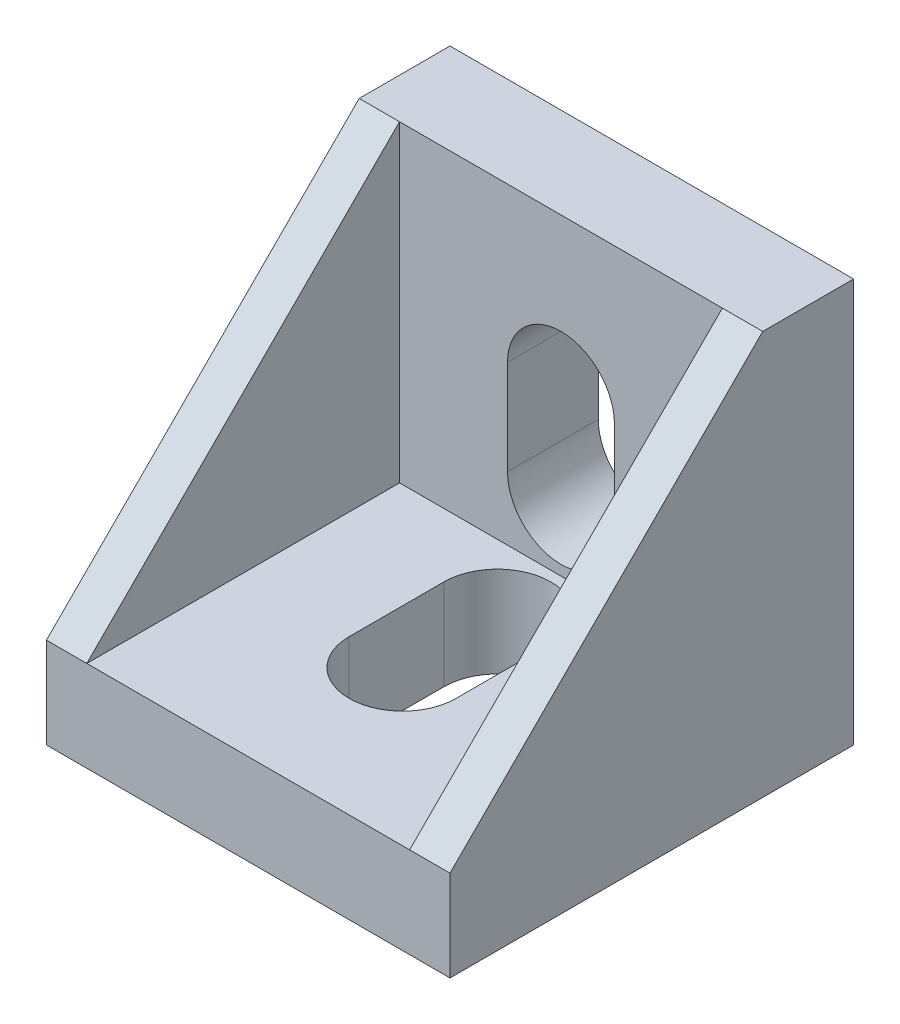
ISO-10303-21;
HEADER;
FILE_DESCRIPTION(('STEP AP214'),'2;1');
FILE_NAME('part.step','',(''),(''),'','','');
FILE_SCHEMA(('AUTOMOTIVE_DESIGN { 1 0 10303 214 1 1 1 1 }'));
ENDSEC;
DATA;
#1=APPLICATION_CONTEXT('core data for automotive mechanical design processes');
#2=APPLICATION_PROTOCOL_DEFINITION('international standard','automotive_design',2000,#1);
#3=PRODUCT_CONTEXT('',#1,'mechanical');
#4=PRODUCT('Part','Part','',(#3));
#5=PRODUCT_RELATED_PRODUCT_CATEGORY('part','',(#4));
#6=PRODUCT_DEFINITION_FORMATION('','',#4);
#7=PRODUCT_DEFINITION_CONTEXT('part definition',#1,'design');
#8=PRODUCT_DEFINITION('design','',#6,#7);
#9=PRODUCT_DEFINITION_SHAPE('','',#8);
#10=(LENGTH_UNIT() NAMED_UNIT(*) SI_UNIT(.MILLI.,.METRE.));
#11=(NAMED_UNIT(*) PLANE_ANGLE_UNIT() SI_UNIT($,.RADIAN.));
#12=(NAMED_UNIT(*) SI_UNIT($,.STERADIAN.) SOLID_ANGLE_UNIT());
#13=UNCERTAINTY_MEASURE_WITH_UNIT(LENGTH_MEASURE(1.E-05),#10,'distance_accuracy_value','');
#14=(GEOMETRIC_REPRESENTATION_CONTEXT(3) GLOBAL_UNCERTAINTY_ASSIGNED_CONTEXT((#13)) GLOBAL_UNIT_ASSIGNED_CONTEXT((#10,
#11,#12)) REPRESENTATION_CONTEXT('',''));
#15=CARTESIAN_POINT('',(0.,0.,0.));
#16=DIRECTION('',(0.,0.,1.));
#17=DIRECTION('',(1.,0.,0.));
#18=AXIS2_PLACEMENT_3D('',#15,#16,#17);
#19=CARTESIAN_POINT('',(0.,0.,4.5));
#20=DIRECTION('',(0.,0.,1.));
#21=DIRECTION('',(1.,0.,0.));
#22=AXIS2_PLACEMENT_3D('',#19,#20,#21);
#23=PLANE('',#22);
#24=DIRECTION('',(0.,-1.,0.));
#25=VECTOR('',#24,1.);
#26=CARTESIAN_POINT('',(7.35,0.,4.5));
#27=LINE('',#26,#25);
#28=CARTESIAN_POINT('',(7.35,5.17300884955752,4.5));
#29=VERTEX_POINT('',#28);
#30=CARTESIAN_POINT('',(7.35,0.473008849557522,4.5));
#31=VERTEX_POINT('',#30);
#32=EDGE_CURVE('E255',#29,#31,#27,.T.);
#33=ORIENTED_EDGE('',*,*,#32,.F.);
#34=CARTESIAN_POINT('',(10.,5.17300884955752,4.5));
#35=DIRECTION('',(0.,0.,1.));
#36=DIRECTION('',(1.,0.,0.));
#37=AXIS2_PLACEMENT_3D('',#34,#35,#36);
#38=CIRCLE('',#37,2.65);
#39=CARTESIAN_POINT('',(12.65,5.17300884955752,4.5));
#40=VERTEX_POINT('',#39);
#41=EDGE_CURVE('E259',#29,#40,#38,.F.);
#42=ORIENTED_EDGE('',*,*,#41,.T.);
#43=DIRECTION('',(0.,-1.,0.));
#44=VECTOR('',#43,1.);
#45=CARTESIAN_POINT('',(12.65,0.,4.5));
#46=LINE('',#45,#44);
#47=CARTESIAN_POINT('',(12.65,0.473008849557522,4.5));
#48=VERTEX_POINT('',#47);
#49=EDGE_CURVE('E263',#40,#48,#46,.T.);
#50=ORIENTED_EDGE('',*,*,#49,.T.);
#51=CARTESIAN_POINT('',(10.,0.473008849557522,4.5));
#52=DIRECTION('',(0.,0.,1.));
#53=DIRECTION('',(1.,0.,0.));
#54=AXIS2_PLACEMENT_3D('',#51,#52,#53);
#55=CIRCLE('',#54,2.65);
#56=EDGE_CURVE('E266',#31,#48,#55,.T.);
#57=ORIENTED_EDGE('',*,*,#56,.F.);
#58=EDGE_LOOP('',(#33,#42,#50,#57));
#59=FACE_BOUND('',#58,.T.);
#60=DIRECTION('',(1.,0.,0.));
#61=VECTOR('',#60,1.);
#62=CARTESIAN_POINT('',(0.,12.8230088495575,4.5));
#63=LINE('',#62,#61);
#64=CARTESIAN_POINT('',(2.,12.8230088495575,4.5));
#65=VERTEX_POINT('',#64);
#66=CARTESIAN_POINT('',(18.,12.8230088495575,4.5));
#67=VERTEX_POINT('',#66);
#68=EDGE_CURVE('E64',#65,#67,#63,.T.);
#69=ORIENTED_EDGE('',*,*,#68,.F.);
#70=DIRECTION('',(0.,1.,0.));
#71=VECTOR('',#70,1.);
#72=CARTESIAN_POINT('',(2.,-2.67699115044248,4.5));
#73=LINE('',#72,#71);
#74=CARTESIAN_POINT('',(2.,-2.67699115044248,4.5));
#75=VERTEX_POINT('',#74);
#76=EDGE_CURVE('E59',#75,#65,#73,.T.);
#77=ORIENTED_EDGE('',*,*,#76,.F.);
#78=DIRECTION('',(1.,0.,0.));
#79=VECTOR('',#78,1.);
#80=CARTESIAN_POINT('',(0.,-2.67699115044248,4.5));
#81=LINE('',#80,#79);
#82=CARTESIAN_POINT('',(18.,-2.67699115044248,4.5));
#83=VERTEX_POINT('',#82);
#84=EDGE_CURVE('E176',#75,#83,#81,.T.);
#85=ORIENTED_EDGE('',*,*,#84,.T.);
#86=DIRECTION('',(0.,1.,0.));
#87=VECTOR('',#86,1.);
#88=CARTESIAN_POINT('',(18.,-2.67699115044248,4.5));
#89=LINE('',#88,#87);
#90=EDGE_CURVE('E581',#83,#67,#89,.T.);
#91=ORIENTED_EDGE('',*,*,#90,.T.);
#92=EDGE_LOOP('',(#69,#77,#85,#91));
#93=FACE_BOUND('',#92,.T.);
#94=ADVANCED_FACE('F41',(#59,#93),#23,.T.);
#95=CARTESIAN_POINT('',(0.,-2.67699115044248,0.));
#96=DIRECTION('',(0.,-1.,0.));
#97=DIRECTION('',(0.,0.,-1.));
#98=AXIS2_PLACEMENT_3D('',#95,#96,#97);
#99=PLANE('',#98);
#100=DIRECTION('',(0.,0.,1.));
#101=VECTOR('',#100,1.);
#102=CARTESIAN_POINT('',(7.35,-2.67699115044248,0.));
#103=LINE('',#102,#101);
#104=CARTESIAN_POINT('',(7.35,-2.67699115044248,7.65));
#105=VERTEX_POINT('',#104);
#106=CARTESIAN_POINT('',(7.35,-2.67699115044248,12.35));
#107=VERTEX_POINT('',#106);
#108=EDGE_CURVE('E191',#105,#107,#103,.T.);
#109=ORIENTED_EDGE('',*,*,#108,.F.);
#110=CARTESIAN_POINT('',(10.,-2.67699115044248,7.65));
#111=DIRECTION('',(0.,-1.,0.));
#112=DIRECTION('',(0.,0.,-1.));
#113=AXIS2_PLACEMENT_3D('',#110,#111,#112);
#114=CIRCLE('',#113,2.65);
#115=CARTESIAN_POINT('',(12.65,-2.67699115044248,7.65));
#116=VERTEX_POINT('',#115);
#117=EDGE_CURVE('E206',#105,#116,#114,.T.);
#118=ORIENTED_EDGE('',*,*,#117,.T.);
#119=DIRECTION('',(0.,0.,1.));
#120=VECTOR('',#119,1.);
#121=CARTESIAN_POINT('',(12.65,-2.67699115044248,0.));
#122=LINE('',#121,#120);
#123=CARTESIAN_POINT('',(12.65,-2.67699115044248,12.35));
#124=VERTEX_POINT('',#123);
#125=EDGE_CURVE('E202',#116,#124,#122,.T.);
#126=ORIENTED_EDGE('',*,*,#125,.T.);
#127=CARTESIAN_POINT('',(10.,-2.67699115044248,12.35));
#128=DIRECTION('',(0.,-1.,0.));
#129=DIRECTION('',(0.,0.,-1.));
#130=AXIS2_PLACEMENT_3D('',#127,#128,#129);
#131=CIRCLE('',#130,2.65);
#132=EDGE_CURVE('E194',#124,#107,#131,.T.);
#133=ORIENTED_EDGE('',*,*,#132,.T.);
#134=EDGE_LOOP('',(#109,#118,#126,#133));
#135=FACE_BOUND('',#134,.T.);
#136=DIRECTION('',(0.,0.,-1.));
#137=VECTOR('',#136,1.);
#138=CARTESIAN_POINT('',(2.,-2.67699115044248,20.));
#139=LINE('',#138,#137);
#140=CARTESIAN_POINT('',(2.,-2.67699115044248,20.));
#141=VERTEX_POINT('',#140);
#142=EDGE_CURVE('E173',#141,#75,#139,.T.);
#143=ORIENTED_EDGE('',*,*,#142,.F.);
#144=DIRECTION('',(1.,0.,0.));
#145=VECTOR('',#144,1.);
#146=CARTESIAN_POINT('',(0.,-2.67699115044248,20.));
#147=LINE('',#146,#145);
#148=CARTESIAN_POINT('',(18.,-2.67699115044248,20.));
#149=VERTEX_POINT('',#148);
#150=EDGE_CURVE('E155',#141,#149,#147,.T.);
#151=ORIENTED_EDGE('',*,*,#150,.T.);
#152=DIRECTION('',(0.,0.,-1.));
#153=VECTOR('',#152,1.);
#154=CARTESIAN_POINT('',(18.,-2.67699115044248,20.));
#155=LINE('',#154,#153);
#156=EDGE_CURVE('E578',#149,#83,#155,.T.);
#157=ORIENTED_EDGE('',*,*,#156,.T.);
#158=ORIENTED_EDGE('',*,*,#84,.F.);
#159=EDGE_LOOP('',(#143,#151,#157,#158));
#160=FACE_BOUND('',#159,.T.);
#161=ADVANCED_FACE('F175',(#135,#160),#99,.F.);
#162=CARTESIAN_POINT('',(7.35,0.,4.5));
#163=DIRECTION('',(1.,0.,0.));
#164=DIRECTION('',(0.,0.,-1.));
#165=AXIS2_PLACEMENT_3D('',#162,#163,#164);
#166=PLANE('',#165);
#167=DIRECTION('',(0.,-1.,0.));
#168=VECTOR('',#167,1.);
#169=CARTESIAN_POINT('',(7.35,0.,0.));
#170=LINE('',#169,#168);
#171=CARTESIAN_POINT('',(7.35,5.17300884955752,0.));
#172=VERTEX_POINT('',#171);
#173=CARTESIAN_POINT('',(7.35,0.473008849557522,0.));
#174=VERTEX_POINT('',#173);
#175=EDGE_CURVE('E284',#172,#174,#170,.T.);
#176=ORIENTED_EDGE('',*,*,#175,.F.);
#177=DIRECTION('',(0.,0.,-1.));
#178=VECTOR('',#177,1.);
#179=CARTESIAN_POINT('',(7.35,5.17300884955752,4.5));
#180=LINE('',#179,#178);
#181=EDGE_CURVE('E11',#29,#172,#180,.T.);
#182=ORIENTED_EDGE('',*,*,#181,.F.);
#183=ORIENTED_EDGE('',*,*,#32,.T.);
#184=DIRECTION('',(0.,0.,-1.));
#185=VECTOR('',#184,1.);
#186=CARTESIAN_POINT('',(7.35,0.473008849557522,4.5));
#187=LINE('',#186,#185);
#188=EDGE_CURVE('E300',#31,#174,#187,.T.);
#189=ORIENTED_EDGE('',*,*,#188,.T.);
#190=EDGE_LOOP('',(#176,#182,#183,#189));
#191=FACE_BOUND('',#190,.T.);
#192=ADVANCED_FACE('F350',(#191),#166,.T.);
#193=CARTESIAN_POINT('',(10.,5.17300884955752,4.5));
#194=DIRECTION('',(0.,0.,-1.));
#195=DIRECTION('',(-1.,0.,0.));
#196=AXIS2_PLACEMENT_3D('',#193,#194,#195);
#197=CYLINDRICAL_SURFACE('',#196,2.65);
#198=CARTESIAN_POINT('',(10.,5.17300884955752,0.));
#199=DIRECTION('',(0.,0.,1.));
#200=DIRECTION('',(1.,0.,0.));
#201=AXIS2_PLACEMENT_3D('',#198,#199,#200);
#202=CIRCLE('',#201,2.65);
#203=CARTESIAN_POINT('',(12.65,5.17300884955752,0.));
#204=VERTEX_POINT('',#203);
#205=EDGE_CURVE('E288',#172,#204,#202,.F.);
#206=ORIENTED_EDGE('',*,*,#205,.T.);
#207=DIRECTION('',(0.,0.,-1.));
#208=VECTOR('',#207,1.);
#209=CARTESIAN_POINT('',(12.65,5.17300884955752,4.5));
#210=LINE('',#209,#208);
#211=EDGE_CURVE('E51',#40,#204,#210,.T.);
#212=ORIENTED_EDGE('',*,*,#211,.F.);
#213=ORIENTED_EDGE('',*,*,#41,.F.);
#214=ORIENTED_EDGE('',*,*,#181,.T.);
#215=EDGE_LOOP('',(#206,#212,#213,#214));
#216=FACE_BOUND('',#215,.T.);
#217=ADVANCED_FACE('F366',(#216),#197,.F.);
#218=CARTESIAN_POINT('',(12.65,0.,4.5));
#219=DIRECTION('',(1.,0.,0.));
#220=DIRECTION('',(0.,0.,-1.));
#221=AXIS2_PLACEMENT_3D('',#218,#219,#220);
#222=PLANE('',#221);
#223=DIRECTION('',(0.,-1.,0.));
#224=VECTOR('',#223,1.);
#225=CARTESIAN_POINT('',(12.65,0.,0.));
#226=LINE('',#225,#224);
#227=CARTESIAN_POINT('',(12.65,0.473008849557522,0.));
#228=VERTEX_POINT('',#227);
#229=EDGE_CURVE('E292',#204,#228,#226,.T.);
#230=ORIENTED_EDGE('',*,*,#229,.T.);
#231=DIRECTION('',(0.,0.,-1.));
#232=VECTOR('',#231,1.);
#233=CARTESIAN_POINT('',(12.65,0.473008849557522,4.5));
#234=LINE('',#233,#232);
#235=EDGE_CURVE('E303',#48,#228,#234,.T.);
#236=ORIENTED_EDGE('',*,*,#235,.F.);
#237=ORIENTED_EDGE('',*,*,#49,.F.);
#238=ORIENTED_EDGE('',*,*,#211,.T.);
#239=EDGE_LOOP('',(#230,#236,#237,#238));
#240=FACE_BOUND('',#239,.T.);
#241=ADVANCED_FACE('F363',(#240),#222,.F.);
#242=CARTESIAN_POINT('',(0.,-7.17699115044248,4.5));
#243=DIRECTION('',(0.,1.,0.));
#244=DIRECTION('',(0.,0.,1.));
#245=AXIS2_PLACEMENT_3D('',#242,#243,#244);
#246=PLANE('',#245);
#247=DIRECTION('',(1.,0.,0.));
#248=VECTOR('',#247,1.);
#249=CARTESIAN_POINT('',(0.,-7.17699115044248,0.));
#250=LINE('',#249,#248);
#251=CARTESIAN_POINT('',(0.,-7.17699115044248,0.));
#252=VERTEX_POINT('',#251);
#253=CARTESIAN_POINT('',(20.,-7.17699115044248,0.));
#254=VERTEX_POINT('',#253);
#255=EDGE_CURVE('E251',#252,#254,#250,.T.);
#256=ORIENTED_EDGE('',*,*,#255,.T.);
#257=DIRECTION('',(0.,0.,-1.));
#258=VECTOR('',#257,1.);
#259=CARTESIAN_POINT('',(20.,-7.17699115044248,4.5));
#260=LINE('',#259,#258);
#261=CARTESIAN_POINT('',(20.,-7.17699115044248,20.));
#262=VERTEX_POINT('',#261);
#263=EDGE_CURVE('E45',#262,#254,#260,.T.);
#264=ORIENTED_EDGE('',*,*,#263,.F.);
#265=DIRECTION('',(1.,0.,0.));
#266=VECTOR('',#265,1.);
#267=CARTESIAN_POINT('',(0.,-7.17699115044248,20.));
#268=LINE('',#267,#266);
#269=CARTESIAN_POINT('',(0.,-7.17699115044248,20.));
#270=VERTEX_POINT('',#269);
#271=EDGE_CURVE('E211',#270,#262,#268,.T.);
#272=ORIENTED_EDGE('',*,*,#271,.F.);
#273=DIRECTION('',(0.,0.,-1.));
#274=VECTOR('',#273,1.);
#275=CARTESIAN_POINT('',(0.,-7.17699115044248,4.5));
#276=LINE('',#275,#274);
#277=EDGE_CURVE('E270',#270,#252,#276,.T.);
#278=ORIENTED_EDGE('',*,*,#277,.T.);
#279=EDGE_LOOP('',(#256,#264,#272,#278));
#280=FACE_BOUND('',#279,.T.);
#281=DIRECTION('',(0.,0.,1.));
#282=VECTOR('',#281,1.);
#283=CARTESIAN_POINT('',(7.35,-7.17699115044248,0.));
#284=LINE('',#283,#282);
#285=CARTESIAN_POINT('',(7.35,-7.17699115044248,7.65));
#286=VERTEX_POINT('',#285);
#287=CARTESIAN_POINT('',(7.35,-7.17699115044248,12.35));
#288=VERTEX_POINT('',#287);
#289=EDGE_CURVE('E214',#286,#288,#284,.T.);
#290=ORIENTED_EDGE('',*,*,#289,.T.);
#291=CARTESIAN_POINT('',(10.,-7.17699115044248,12.35));
#292=DIRECTION('',(0.,-1.,0.));
#293=DIRECTION('',(0.,0.,-1.));
#294=AXIS2_PLACEMENT_3D('',#291,#292,#293);
#295=CIRCLE('',#294,2.65);
#296=CARTESIAN_POINT('',(12.65,-7.17699115044248,12.35));
#297=VERTEX_POINT('',#296);
#298=EDGE_CURVE('E218',#297,#288,#295,.T.);
#299=ORIENTED_EDGE('',*,*,#298,.F.);
#300=DIRECTION('',(0.,0.,1.));
#301=VECTOR('',#300,1.);
#302=CARTESIAN_POINT('',(12.65,-7.17699115044248,0.));
#303=LINE('',#302,#301);
#304=CARTESIAN_POINT('',(12.65,-7.17699115044248,7.65));
#305=VERTEX_POINT('',#304);
#306=EDGE_CURVE('E222',#305,#297,#303,.T.);
#307=ORIENTED_EDGE('',*,*,#306,.F.);
#308=CARTESIAN_POINT('',(10.,-7.17699115044248,7.65));
#309=DIRECTION('',(0.,-1.,0.));
#310=DIRECTION('',(0.,0.,-1.));
#311=AXIS2_PLACEMENT_3D('',#308,#309,#310);
#312=CIRCLE('',#311,2.65);
#313=EDGE_CURVE('E170',#286,#305,#312,.T.);
#314=ORIENTED_EDGE('',*,*,#313,.F.);
#315=EDGE_LOOP('',(#290,#299,#307,#314));
#316=FACE_BOUND('',#315,.T.);
#317=ADVANCED_FACE('F43',(#280,#316),#246,.F.);
#318=CARTESIAN_POINT('',(20.,0.,4.5));
#319=DIRECTION('',(-1.,0.,0.));
#320=DIRECTION('',(0.,-1.,0.));
#321=AXIS2_PLACEMENT_3D('',#318,#319,#320);
#322=PLANE('',#321);
#323=DIRECTION('',(0.,0.,-1.));
#324=VECTOR('',#323,1.);
#325=CARTESIAN_POINT('',(20.,12.8230088495575,4.5));
#326=LINE('',#325,#324);
#327=CARTESIAN_POINT('',(20.,12.8230088495575,4.5));
#328=VERTEX_POINT('',#327);
#329=CARTESIAN_POINT('',(20.,12.8230088495575,0.));
#330=VERTEX_POINT('',#329);
#331=EDGE_CURVE('E314',#328,#330,#326,.T.);
#332=ORIENTED_EDGE('',*,*,#331,.F.);
#333=DIRECTION('',(0.,-0.707106781186548,0.707106781186548));
#334=VECTOR('',#333,1.);
#335=CARTESIAN_POINT('',(20.,-2.67699115044248,20.));
#336=LINE('',#335,#334);
#337=CARTESIAN_POINT('',(20.,-2.67699115044248,20.));
#338=VERTEX_POINT('',#337);
#339=EDGE_CURVE('E583',#328,#338,#336,.T.);
#340=ORIENTED_EDGE('',*,*,#339,.T.);
#341=DIRECTION('',(0.,-1.,0.));
#342=VECTOR('',#341,1.);
#343=CARTESIAN_POINT('',(20.,-2.67699115044248,20.));
#344=LINE('',#343,#342);
#345=EDGE_CURVE('E243',#338,#262,#344,.T.);
#346=ORIENTED_EDGE('',*,*,#345,.T.);
#347=ORIENTED_EDGE('',*,*,#263,.T.);
#348=DIRECTION('',(0.,1.,0.));
#349=VECTOR('',#348,1.);
#350=CARTESIAN_POINT('',(20.,0.,0.));
#351=LINE('',#350,#349);
#352=EDGE_CURVE('E274',#254,#330,#351,.T.);
#353=ORIENTED_EDGE('',*,*,#352,.T.);
#354=EDGE_LOOP('',(#332,#340,#346,#347,#353));
#355=FACE_BOUND('',#354,.T.);
#356=ADVANCED_FACE('F324',(#355),#322,.F.);
#357=CARTESIAN_POINT('',(0.,12.8230088495575,4.5));
#358=DIRECTION('',(0.,1.,0.));
#359=DIRECTION('',(0.,0.,1.));
#360=AXIS2_PLACEMENT_3D('',#357,#358,#359);
#361=PLANE('',#360);
#362=DIRECTION('',(1.,0.,0.));
#363=VECTOR('',#362,1.);
#364=CARTESIAN_POINT('',(0.,12.8230088495575,0.));
#365=LINE('',#364,#363);
#366=CARTESIAN_POINT('',(0.,12.8230088495575,0.));
#367=VERTEX_POINT('',#366);
#368=EDGE_CURVE('E277',#367,#330,#365,.T.);
#369=ORIENTED_EDGE('',*,*,#368,.F.);
#370=DIRECTION('',(0.,0.,-1.));
#371=VECTOR('',#370,1.);
#372=CARTESIAN_POINT('',(0.,12.8230088495575,4.5));
#373=LINE('',#372,#371);
#374=CARTESIAN_POINT('',(0.,12.8230088495575,4.5));
#375=VERTEX_POINT('',#374);
#376=EDGE_CURVE('E311',#375,#367,#373,.T.);
#377=ORIENTED_EDGE('',*,*,#376,.F.);
#378=EDGE_CURVE('E252',#375,#65,#63,.T.);
#379=ORIENTED_EDGE('',*,*,#378,.T.);
#380=ORIENTED_EDGE('',*,*,#68,.T.);
#381=DIRECTION('',(1.,0.,0.));
#382=VECTOR('',#381,1.);
#383=CARTESIAN_POINT('',(18.,12.8230088495575,4.5));
#384=LINE('',#383,#382);
#385=EDGE_CURVE('E197',#67,#328,#384,.T.);
#386=ORIENTED_EDGE('',*,*,#385,.T.);
#387=ORIENTED_EDGE('',*,*,#331,.T.);
#388=EDGE_LOOP('',(#369,#377,#379,#380,#386,#387));
#389=FACE_BOUND('',#388,.T.);
#390=ADVANCED_FACE('F335',(#389),#361,.T.);
#391=CARTESIAN_POINT('',(0.,0.,4.5));
#392=DIRECTION('',(-1.,0.,0.));
#393=DIRECTION('',(0.,-1.,0.));
#394=AXIS2_PLACEMENT_3D('',#391,#392,#393);
#395=PLANE('',#394);
#396=DIRECTION('',(0.,-1.,0.));
#397=VECTOR('',#396,1.);
#398=CARTESIAN_POINT('',(0.,-2.67699115044248,20.));
#399=LINE('',#398,#397);
#400=CARTESIAN_POINT('',(0.,-2.67699115044248,20.));
#401=VERTEX_POINT('',#400);
#402=EDGE_CURVE('E210',#401,#270,#399,.T.);
#403=ORIENTED_EDGE('',*,*,#402,.F.);
#404=DIRECTION('',(0.,-0.707106781186548,0.707106781186548));
#405=VECTOR('',#404,1.);
#406=CARTESIAN_POINT('',(0.,-2.67699115044248,20.));
#407=LINE('',#406,#405);
#408=EDGE_CURVE('E180',#375,#401,#407,.T.);
#409=ORIENTED_EDGE('',*,*,#408,.F.);
#410=ORIENTED_EDGE('',*,*,#376,.T.);
#411=DIRECTION('',(0.,1.,0.));
#412=VECTOR('',#411,1.);
#413=CARTESIAN_POINT('',(0.,0.,0.));
#414=LINE('',#413,#412);
#415=EDGE_CURVE('E281',#252,#367,#414,.T.);
#416=ORIENTED_EDGE('',*,*,#415,.F.);
#417=ORIENTED_EDGE('',*,*,#277,.F.);
#418=EDGE_LOOP('',(#403,#409,#410,#416,#417));
#419=FACE_BOUND('',#418,.T.);
#420=ADVANCED_FACE('F334',(#419),#395,.T.);
#421=CARTESIAN_POINT('',(10.,0.473008849557522,4.5));
#422=DIRECTION('',(0.,0.,-1.));
#423=DIRECTION('',(-1.,0.,0.));
#424=AXIS2_PLACEMENT_3D('',#421,#422,#423);
#425=CYLINDRICAL_SURFACE('',#424,2.65);
#426=CARTESIAN_POINT('',(10.,0.473008849557522,0.));
#427=DIRECTION('',(0.,0.,1.));
#428=DIRECTION('',(1.,0.,0.));
#429=AXIS2_PLACEMENT_3D('',#426,#427,#428);
#430=CIRCLE('',#429,2.65);
#431=EDGE_CURVE('E296',#174,#228,#430,.T.);
#432=ORIENTED_EDGE('',*,*,#431,.F.);
#433=ORIENTED_EDGE('',*,*,#188,.F.);
#434=ORIENTED_EDGE('',*,*,#56,.T.);
#435=ORIENTED_EDGE('',*,*,#235,.T.);
#436=EDGE_LOOP('',(#432,#433,#434,#435));
#437=FACE_BOUND('',#436,.T.);
#438=ADVANCED_FACE('F342',(#437),#425,.F.);
#439=CARTESIAN_POINT('',(0.,0.,0.));
#440=DIRECTION('',(0.,0.,1.));
#441=DIRECTION('',(1.,0.,0.));
#442=AXIS2_PLACEMENT_3D('',#439,#440,#441);
#443=PLANE('',#442);
#444=ORIENTED_EDGE('',*,*,#415,.T.);
#445=ORIENTED_EDGE('',*,*,#368,.T.);
#446=ORIENTED_EDGE('',*,*,#352,.F.);
#447=ORIENTED_EDGE('',*,*,#255,.F.);
#448=EDGE_LOOP('',(#444,#445,#446,#447));
#449=FACE_BOUND('',#448,.T.);
#450=ORIENTED_EDGE('',*,*,#175,.T.);
#451=ORIENTED_EDGE('',*,*,#431,.T.);
#452=ORIENTED_EDGE('',*,*,#229,.F.);
#453=ORIENTED_EDGE('',*,*,#205,.F.);
#454=EDGE_LOOP('',(#450,#451,#452,#453));
#455=FACE_BOUND('',#454,.T.);
#456=ADVANCED_FACE('F331',(#449,#455),#443,.F.);
#457=CARTESIAN_POINT('',(7.35,-2.67699115044248,0.));
#458=DIRECTION('',(1.,0.,0.));
#459=DIRECTION('',(0.,0.,-1.));
#460=AXIS2_PLACEMENT_3D('',#457,#458,#459);
#461=PLANE('',#460);
#462=ORIENTED_EDGE('',*,*,#289,.F.);
#463=DIRECTION('',(0.,-1.,0.));
#464=VECTOR('',#463,1.);
#465=CARTESIAN_POINT('',(7.35,-2.67699115044248,7.65));
#466=LINE('',#465,#464);
#467=EDGE_CURVE('E229',#105,#286,#466,.T.);
#468=ORIENTED_EDGE('',*,*,#467,.F.);
#469=ORIENTED_EDGE('',*,*,#108,.T.);
#470=DIRECTION('',(0.,-1.,0.));
#471=VECTOR('',#470,1.);
#472=CARTESIAN_POINT('',(7.35,-2.67699115044248,12.35));
#473=LINE('',#472,#471);
#474=EDGE_CURVE('E240',#107,#288,#473,.T.);
#475=ORIENTED_EDGE('',*,*,#474,.T.);
#476=EDGE_LOOP('',(#462,#468,#469,#475));
#477=FACE_BOUND('',#476,.T.);
#478=ADVANCED_FACE('F359',(#477),#461,.T.);
#479=CARTESIAN_POINT('',(10.,-2.67699115044248,7.65));
#480=DIRECTION('',(0.,-1.,0.));
#481=DIRECTION('',(0.,0.,-1.));
#482=AXIS2_PLACEMENT_3D('',#479,#480,#481);
#483=CYLINDRICAL_SURFACE('',#482,2.65);
#484=ORIENTED_EDGE('',*,*,#313,.T.);
#485=DIRECTION('',(0.,-1.,0.));
#486=VECTOR('',#485,1.);
#487=CARTESIAN_POINT('',(12.65,-2.67699115044248,7.65));
#488=LINE('',#487,#486);
#489=EDGE_CURVE('E232',#116,#305,#488,.T.);
#490=ORIENTED_EDGE('',*,*,#489,.F.);
#491=ORIENTED_EDGE('',*,*,#117,.F.);
#492=ORIENTED_EDGE('',*,*,#467,.T.);
#493=EDGE_LOOP('',(#484,#490,#491,#492));
#494=FACE_BOUND('',#493,.T.);
#495=ADVANCED_FACE('F485',(#494),#483,.F.);
#496=CARTESIAN_POINT('',(12.65,-2.67699115044248,0.));
#497=DIRECTION('',(1.,0.,0.));
#498=DIRECTION('',(0.,0.,-1.));
#499=AXIS2_PLACEMENT_3D('',#496,#497,#498);
#500=PLANE('',#499);
#501=ORIENTED_EDGE('',*,*,#306,.T.);
#502=DIRECTION('',(0.,-1.,0.));
#503=VECTOR('',#502,1.);
#504=CARTESIAN_POINT('',(12.65,-2.67699115044248,12.35));
#505=LINE('',#504,#503);
#506=EDGE_CURVE('E236',#124,#297,#505,.T.);
#507=ORIENTED_EDGE('',*,*,#506,.F.);
#508=ORIENTED_EDGE('',*,*,#125,.F.);
#509=ORIENTED_EDGE('',*,*,#489,.T.);
#510=EDGE_LOOP('',(#501,#507,#508,#509));
#511=FACE_BOUND('',#510,.T.);
#512=ADVANCED_FACE('F465',(#511),#500,.F.);
#513=CARTESIAN_POINT('',(0.,-2.67699115044248,20.));
#514=DIRECTION('',(0.,0.,-1.));
#515=DIRECTION('',(-1.,0.,0.));
#516=AXIS2_PLACEMENT_3D('',#513,#514,#515);
#517=PLANE('',#516);
#518=ORIENTED_EDGE('',*,*,#271,.T.);
#519=ORIENTED_EDGE('',*,*,#345,.F.);
#520=DIRECTION('',(1.,0.,0.));
#521=VECTOR('',#520,1.);
#522=CARTESIAN_POINT('',(18.,-2.67699115044248,20.));
#523=LINE('',#522,#521);
#524=EDGE_CURVE('E165',#149,#338,#523,.T.);
#525=ORIENTED_EDGE('',*,*,#524,.F.);
#526=ORIENTED_EDGE('',*,*,#150,.F.);
#527=EDGE_CURVE('E161',#401,#141,#147,.T.);
#528=ORIENTED_EDGE('',*,*,#527,.F.);
#529=ORIENTED_EDGE('',*,*,#402,.T.);
#530=EDGE_LOOP('',(#518,#519,#525,#526,#528,#529));
#531=FACE_BOUND('',#530,.T.);
#532=ADVANCED_FACE('F158',(#531),#517,.F.);
#533=CARTESIAN_POINT('',(10.,-2.67699115044248,12.35));
#534=DIRECTION('',(0.,-1.,0.));
#535=DIRECTION('',(0.,0.,-1.));
#536=AXIS2_PLACEMENT_3D('',#533,#534,#535);
#537=CYLINDRICAL_SURFACE('',#536,2.65);
#538=ORIENTED_EDGE('',*,*,#298,.T.);
#539=ORIENTED_EDGE('',*,*,#474,.F.);
#540=ORIENTED_EDGE('',*,*,#132,.F.);
#541=ORIENTED_EDGE('',*,*,#506,.T.);
#542=EDGE_LOOP('',(#538,#539,#540,#541));
#543=FACE_BOUND('',#542,.T.);
#544=ADVANCED_FACE('F412',(#543),#537,.F.);
#545=CARTESIAN_POINT('',(18.,-2.67699115044248,20.));
#546=DIRECTION('',(0.,0.707106781186547,0.707106781186548));
#547=DIRECTION('',(0.,-0.707106781186548,0.707106781186547));
#548=AXIS2_PLACEMENT_3D('',#545,#546,#547);
#549=PLANE('',#548);
#550=ORIENTED_EDGE('',*,*,#339,.F.);
#551=ORIENTED_EDGE('',*,*,#385,.F.);
#552=DIRECTION('',(0.,-0.707106781186548,0.707106781186548));
#553=VECTOR('',#552,1.);
#554=CARTESIAN_POINT('',(18.,-2.67699115044248,20.));
#555=LINE('',#554,#553);
#556=EDGE_CURVE('E580',#67,#149,#555,.T.);
#557=ORIENTED_EDGE('',*,*,#556,.T.);
#558=ORIENTED_EDGE('',*,*,#524,.T.);
#559=EDGE_LOOP('',(#550,#551,#557,#558));
#560=FACE_BOUND('',#559,.T.);
#561=ADVANCED_FACE('F416',(#560),#549,.T.);
#562=CARTESIAN_POINT('',(18.,0.,0.));
#563=DIRECTION('',(1.,0.,0.));
#564=DIRECTION('',(0.,0.,-1.));
#565=AXIS2_PLACEMENT_3D('',#562,#563,#564);
#566=PLANE('',#565);
#567=ORIENTED_EDGE('',*,*,#156,.F.);
#568=ORIENTED_EDGE('',*,*,#556,.F.);
#569=ORIENTED_EDGE('',*,*,#90,.F.);
#570=EDGE_LOOP('',(#567,#568,#569));
#571=FACE_BOUND('',#570,.T.);
#572=ADVANCED_FACE('F420',(#571),#566,.F.);
#573=CARTESIAN_POINT('',(2.,-2.67699115044248,20.));
#574=DIRECTION('',(0.,-0.707106781186547,-0.707106781186548));
#575=DIRECTION('',(0.,0.707106781186548,-0.707106781186547));
#576=AXIS2_PLACEMENT_3D('',#573,#574,#575);
#577=PLANE('',#576);
#578=ORIENTED_EDGE('',*,*,#408,.T.);
#579=ORIENTED_EDGE('',*,*,#527,.T.);
#580=DIRECTION('',(0.,-0.707106781186548,0.707106781186548));
#581=VECTOR('',#580,1.);
#582=CARTESIAN_POINT('',(2.,-2.67699115044248,20.));
#583=LINE('',#582,#581);
#584=EDGE_CURVE('E179',#65,#141,#583,.T.);
#585=ORIENTED_EDGE('',*,*,#584,.F.);
#586=ORIENTED_EDGE('',*,*,#378,.F.);
#587=EDGE_LOOP('',(#578,#579,#585,#586));
#588=FACE_BOUND('',#587,.T.);
#589=ADVANCED_FACE('F188',(#588),#577,.F.);
#590=CARTESIAN_POINT('',(2.,0.,0.));
#591=DIRECTION('',(-1.,0.,0.));
#592=DIRECTION('',(0.,0.,-1.));
#593=AXIS2_PLACEMENT_3D('',#590,#591,#592);
#594=PLANE('',#593);
#595=ORIENTED_EDGE('',*,*,#142,.T.);
#596=ORIENTED_EDGE('',*,*,#76,.T.);
#597=ORIENTED_EDGE('',*,*,#584,.T.);
#598=EDGE_LOOP('',(#595,#596,#597));
#599=FACE_BOUND('',#598,.T.);
#600=ADVANCED_FACE('F183',(#599),#594,.F.);
#601=CLOSED_SHELL('',(#94,#161,#192,#217,#241,#317,#356,#390,#420,#438,#456,#478,#495,#512,#532,
#544,#561,#572,#589,#600));
#602=MANIFOLD_SOLID_BREP('B2',#601);
#603=ADVANCED_BREP_SHAPE_REPRESENTATION('',(#18,#602),#14);
#604=SHAPE_DEFINITION_REPRESENTATION(#9,#603);
ENDSEC;
END-ISO-10303-21;
